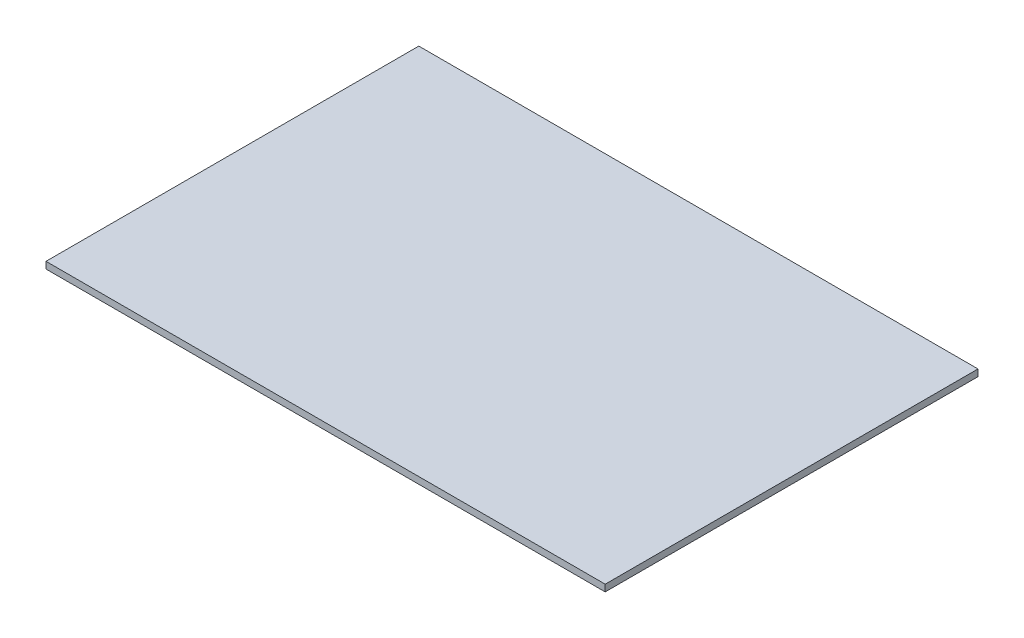
ISO-10303-21;
HEADER;
FILE_DESCRIPTION(('STEP AP214'),'2;1');
FILE_NAME('part.step','',(''),(''),'','','');
FILE_SCHEMA(('AUTOMOTIVE_DESIGN { 1 0 10303 214 1 1 1 1 }'));
ENDSEC;
DATA;
#1=APPLICATION_CONTEXT('core data for automotive mechanical design processes');
#2=APPLICATION_PROTOCOL_DEFINITION('international standard','automotive_design',2000,#1);
#3=PRODUCT_CONTEXT('',#1,'mechanical');
#4=PRODUCT('Part','Part','',(#3));
#5=PRODUCT_RELATED_PRODUCT_CATEGORY('part','',(#4));
#6=PRODUCT_DEFINITION_FORMATION('','',#4);
#7=PRODUCT_DEFINITION_CONTEXT('part definition',#1,'design');
#8=PRODUCT_DEFINITION('design','',#6,#7);
#9=PRODUCT_DEFINITION_SHAPE('','',#8);
#10=(LENGTH_UNIT() NAMED_UNIT(*) SI_UNIT(.MILLI.,.METRE.));
#11=(NAMED_UNIT(*) PLANE_ANGLE_UNIT() SI_UNIT($,.RADIAN.));
#12=(NAMED_UNIT(*) SI_UNIT($,.STERADIAN.) SOLID_ANGLE_UNIT());
#13=UNCERTAINTY_MEASURE_WITH_UNIT(LENGTH_MEASURE(1.E-05),#10,'distance_accuracy_value','');
#14=(GEOMETRIC_REPRESENTATION_CONTEXT(3) GLOBAL_UNCERTAINTY_ASSIGNED_CONTEXT((#13)) GLOBAL_UNIT_ASSIGNED_CONTEXT((#10,
#11,#12)) REPRESENTATION_CONTEXT('',''));
#15=CARTESIAN_POINT('',(0.,0.,0.));
#16=DIRECTION('',(0.,0.,1.));
#17=DIRECTION('',(1.,0.,0.));
#18=AXIS2_PLACEMENT_3D('',#15,#16,#17);
#19=CARTESIAN_POINT('',(750.,18.,-500.));
#20=DIRECTION('',(-1.,0.,0.));
#21=DIRECTION('',(0.,0.,1.));
#22=AXIS2_PLACEMENT_3D('',#19,#20,#21);
#23=PLANE('',#22);
#24=DIRECTION('',(0.,0.,-1.));
#25=VECTOR('',#24,1.);
#26=CARTESIAN_POINT('',(750.,0.,-500.));
#27=LINE('',#26,#25);
#28=CARTESIAN_POINT('',(750.,0.,500.));
#29=VERTEX_POINT('',#28);
#30=CARTESIAN_POINT('',(750.,0.,-500.));
#31=VERTEX_POINT('',#30);
#32=EDGE_CURVE('E96',#29,#31,#27,.T.);
#33=ORIENTED_EDGE('',*,*,#32,.T.);
#34=DIRECTION('',(0.,-1.,0.));
#35=VECTOR('',#34,1.);
#36=CARTESIAN_POINT('',(750.,18.,-500.));
#37=LINE('',#36,#35);
#38=CARTESIAN_POINT('',(750.,18.,-500.));
#39=VERTEX_POINT('',#38);
#40=EDGE_CURVE('E11',#39,#31,#37,.T.);
#41=ORIENTED_EDGE('',*,*,#40,.F.);
#42=DIRECTION('',(0.,0.,-1.));
#43=VECTOR('',#42,1.);
#44=CARTESIAN_POINT('',(750.,18.,-500.));
#45=LINE('',#44,#43);
#46=CARTESIAN_POINT('',(750.,18.,500.));
#47=VERTEX_POINT('',#46);
#48=EDGE_CURVE('E84',#47,#39,#45,.T.);
#49=ORIENTED_EDGE('',*,*,#48,.F.);
#50=DIRECTION('',(0.,-1.,0.));
#51=VECTOR('',#50,1.);
#52=CARTESIAN_POINT('',(750.,18.,500.));
#53=LINE('',#52,#51);
#54=EDGE_CURVE('E92',#47,#29,#53,.T.);
#55=ORIENTED_EDGE('',*,*,#54,.T.);
#56=EDGE_LOOP('',(#33,#41,#49,#55));
#57=FACE_BOUND('',#56,.T.);
#58=ADVANCED_FACE('F33',(#57),#23,.F.);
#59=CARTESIAN_POINT('',(-750.,18.,-500.));
#60=DIRECTION('',(0.,0.,1.));
#61=DIRECTION('',(1.,0.,0.));
#62=AXIS2_PLACEMENT_3D('',#59,#60,#61);
#63=PLANE('',#62);
#64=DIRECTION('',(-1.,0.,0.));
#65=VECTOR('',#64,1.);
#66=CARTESIAN_POINT('',(-750.,0.,-500.));
#67=LINE('',#66,#65);
#68=CARTESIAN_POINT('',(-750.,0.,-500.));
#69=VERTEX_POINT('',#68);
#70=EDGE_CURVE('E88',#31,#69,#67,.T.);
#71=ORIENTED_EDGE('',*,*,#70,.T.);
#72=DIRECTION('',(0.,-1.,0.));
#73=VECTOR('',#72,1.);
#74=CARTESIAN_POINT('',(-750.,18.,-500.));
#75=LINE('',#74,#73);
#76=CARTESIAN_POINT('',(-750.,18.,-500.));
#77=VERTEX_POINT('',#76);
#78=EDGE_CURVE('E41',#77,#69,#75,.T.);
#79=ORIENTED_EDGE('',*,*,#78,.F.);
#80=DIRECTION('',(-1.,0.,0.));
#81=VECTOR('',#80,1.);
#82=CARTESIAN_POINT('',(-750.,18.,-500.));
#83=LINE('',#82,#81);
#84=EDGE_CURVE('E79',#39,#77,#83,.T.);
#85=ORIENTED_EDGE('',*,*,#84,.F.);
#86=ORIENTED_EDGE('',*,*,#40,.T.);
#87=EDGE_LOOP('',(#71,#79,#85,#86));
#88=FACE_BOUND('',#87,.T.);
#89=ADVANCED_FACE('F87',(#88),#63,.F.);
#90=CARTESIAN_POINT('',(-750.,18.,-500.));
#91=DIRECTION('',(1.,0.,0.));
#92=DIRECTION('',(0.,0.,-1.));
#93=AXIS2_PLACEMENT_3D('',#90,#91,#92);
#94=PLANE('',#93);
#95=DIRECTION('',(0.,0.,1.));
#96=VECTOR('',#95,1.);
#97=CARTESIAN_POINT('',(-750.,0.,-500.));
#98=LINE('',#97,#96);
#99=CARTESIAN_POINT('',(-750.,0.,500.));
#100=VERTEX_POINT('',#99);
#101=EDGE_CURVE('E66',#69,#100,#98,.T.);
#102=ORIENTED_EDGE('',*,*,#101,.T.);
#103=DIRECTION('',(0.,-1.,0.));
#104=VECTOR('',#103,1.);
#105=CARTESIAN_POINT('',(-750.,18.,500.));
#106=LINE('',#105,#104);
#107=CARTESIAN_POINT('',(-750.,18.,500.));
#108=VERTEX_POINT('',#107);
#109=EDGE_CURVE('E89',#108,#100,#106,.T.);
#110=ORIENTED_EDGE('',*,*,#109,.F.);
#111=DIRECTION('',(0.,0.,1.));
#112=VECTOR('',#111,1.);
#113=CARTESIAN_POINT('',(-750.,18.,-500.));
#114=LINE('',#113,#112);
#115=EDGE_CURVE('E82',#77,#108,#114,.T.);
#116=ORIENTED_EDGE('',*,*,#115,.F.);
#117=ORIENTED_EDGE('',*,*,#78,.T.);
#118=EDGE_LOOP('',(#102,#110,#116,#117));
#119=FACE_BOUND('',#118,.T.);
#120=ADVANCED_FACE('F90',(#119),#94,.F.);
#121=CARTESIAN_POINT('',(-750.,18.,500.));
#122=DIRECTION('',(0.,0.,-1.));
#123=DIRECTION('',(-1.,0.,0.));
#124=AXIS2_PLACEMENT_3D('',#121,#122,#123);
#125=PLANE('',#124);
#126=DIRECTION('',(1.,0.,0.));
#127=VECTOR('',#126,1.);
#128=CARTESIAN_POINT('',(-750.,0.,500.));
#129=LINE('',#128,#127);
#130=EDGE_CURVE('E72',#100,#29,#129,.T.);
#131=ORIENTED_EDGE('',*,*,#130,.T.);
#132=ORIENTED_EDGE('',*,*,#54,.F.);
#133=DIRECTION('',(1.,0.,0.));
#134=VECTOR('',#133,1.);
#135=CARTESIAN_POINT('',(-750.,18.,500.));
#136=LINE('',#135,#134);
#137=EDGE_CURVE('E49',#108,#47,#136,.T.);
#138=ORIENTED_EDGE('',*,*,#137,.F.);
#139=ORIENTED_EDGE('',*,*,#109,.T.);
#140=EDGE_LOOP('',(#131,#132,#138,#139));
#141=FACE_BOUND('',#140,.T.);
#142=ADVANCED_FACE('F103',(#141),#125,.F.);
#143=CARTESIAN_POINT('',(0.,18.,0.));
#144=DIRECTION('',(0.,1.,0.));
#145=DIRECTION('',(0.,0.,1.));
#146=AXIS2_PLACEMENT_3D('',#143,#144,#145);
#147=PLANE('',#146);
#148=ORIENTED_EDGE('',*,*,#48,.T.);
#149=ORIENTED_EDGE('',*,*,#84,.T.);
#150=ORIENTED_EDGE('',*,*,#115,.T.);
#151=ORIENTED_EDGE('',*,*,#137,.T.);
#152=EDGE_LOOP('',(#148,#149,#150,#151));
#153=FACE_BOUND('',#152,.T.);
#154=ADVANCED_FACE('F80',(#153),#147,.T.);
#155=CARTESIAN_POINT('',(0.,0.,0.));
#156=DIRECTION('',(0.,1.,0.));
#157=DIRECTION('',(0.,0.,1.));
#158=AXIS2_PLACEMENT_3D('',#155,#156,#157);
#159=PLANE('',#158);
#160=ORIENTED_EDGE('',*,*,#32,.F.);
#161=ORIENTED_EDGE('',*,*,#130,.F.);
#162=ORIENTED_EDGE('',*,*,#101,.F.);
#163=ORIENTED_EDGE('',*,*,#70,.F.);
#164=EDGE_LOOP('',(#160,#161,#162,#163));
#165=FACE_BOUND('',#164,.T.);
#166=ADVANCED_FACE('F106',(#165),#159,.F.);
#167=CLOSED_SHELL('',(#58,#89,#120,#142,#154,#166));
#168=MANIFOLD_SOLID_BREP('B2',#167);
#169=ADVANCED_BREP_SHAPE_REPRESENTATION('',(#18,#168),#14);
#170=SHAPE_DEFINITION_REPRESENTATION(#9,#169);
ENDSEC;
END-ISO-10303-21;
